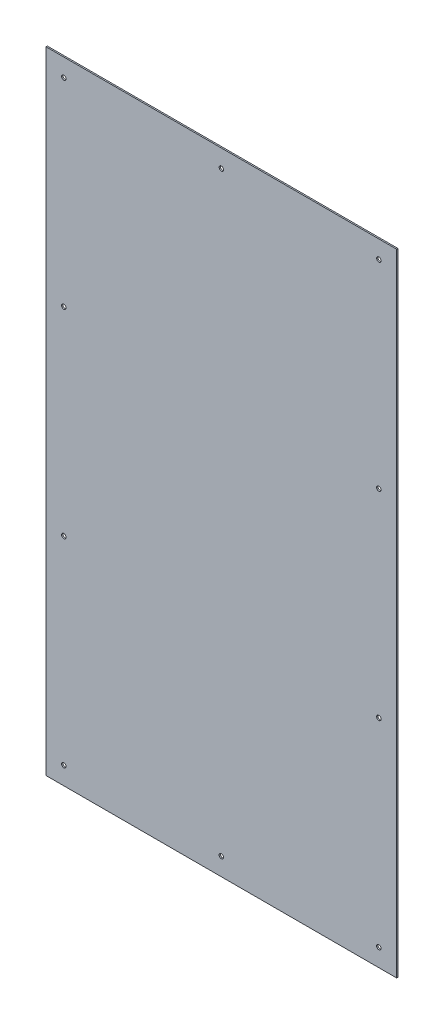
ISO-10303-21;
HEADER;
FILE_DESCRIPTION(('STEP AP214'),'2;1');
FILE_NAME('part.step','',(''),(''),'','','');
FILE_SCHEMA(('AUTOMOTIVE_DESIGN { 1 0 10303 214 1 1 1 1 }'));
ENDSEC;
DATA;
#1=APPLICATION_CONTEXT('core data for automotive mechanical design processes');
#2=APPLICATION_PROTOCOL_DEFINITION('international standard','automotive_design',2000,#1);
#3=PRODUCT_CONTEXT('',#1,'mechanical');
#4=PRODUCT('Part','Part','',(#3));
#5=PRODUCT_RELATED_PRODUCT_CATEGORY('part','',(#4));
#6=PRODUCT_DEFINITION_FORMATION('','',#4);
#7=PRODUCT_DEFINITION_CONTEXT('part definition',#1,'design');
#8=PRODUCT_DEFINITION('design','',#6,#7);
#9=PRODUCT_DEFINITION_SHAPE('','',#8);
#10=(LENGTH_UNIT() NAMED_UNIT(*) SI_UNIT(.MILLI.,.METRE.));
#11=(NAMED_UNIT(*) PLANE_ANGLE_UNIT() SI_UNIT($,.RADIAN.));
#12=(NAMED_UNIT(*) SI_UNIT($,.STERADIAN.) SOLID_ANGLE_UNIT());
#13=UNCERTAINTY_MEASURE_WITH_UNIT(LENGTH_MEASURE(1.E-05),#10,'distance_accuracy_value','');
#14=(GEOMETRIC_REPRESENTATION_CONTEXT(3) GLOBAL_UNCERTAINTY_ASSIGNED_CONTEXT((#13)) GLOBAL_UNIT_ASSIGNED_CONTEXT((#10,
#11,#12)) REPRESENTATION_CONTEXT('',''));
#15=CARTESIAN_POINT('',(0.,0.,0.));
#16=DIRECTION('',(0.,0.,1.));
#17=DIRECTION('',(1.,0.,0.));
#18=AXIS2_PLACEMENT_3D('',#15,#16,#17);
#19=CARTESIAN_POINT('',(250.,450.,1.9));
#20=DIRECTION('',(-1.,0.,0.));
#21=DIRECTION('',(0.,-1.,0.));
#22=AXIS2_PLACEMENT_3D('',#19,#20,#21);
#23=PLANE('',#22);
#24=DIRECTION('',(0.,1.,0.));
#25=VECTOR('',#24,1.);
#26=CARTESIAN_POINT('',(250.,450.,0.));
#27=LINE('',#26,#25);
#28=CARTESIAN_POINT('',(250.,-450.,0.));
#29=VERTEX_POINT('',#28);
#30=CARTESIAN_POINT('',(250.,450.,0.));
#31=VERTEX_POINT('',#30);
#32=EDGE_CURVE('E98',#29,#31,#27,.T.);
#33=ORIENTED_EDGE('',*,*,#32,.T.);
#34=DIRECTION('',(0.,0.,-1.));
#35=VECTOR('',#34,1.);
#36=CARTESIAN_POINT('',(250.,450.,1.9));
#37=LINE('',#36,#35);
#38=CARTESIAN_POINT('',(250.,450.,1.9));
#39=VERTEX_POINT('',#38);
#40=EDGE_CURVE('E11',#39,#31,#37,.T.);
#41=ORIENTED_EDGE('',*,*,#40,.F.);
#42=DIRECTION('',(0.,1.,0.));
#43=VECTOR('',#42,1.);
#44=CARTESIAN_POINT('',(250.,450.,1.9));
#45=LINE('',#44,#43);
#46=CARTESIAN_POINT('',(250.,-450.,1.9));
#47=VERTEX_POINT('',#46);
#48=EDGE_CURVE('E85',#47,#39,#45,.T.);
#49=ORIENTED_EDGE('',*,*,#48,.F.);
#50=DIRECTION('',(0.,0.,-1.));
#51=VECTOR('',#50,1.);
#52=CARTESIAN_POINT('',(250.,-450.,1.9));
#53=LINE('',#52,#51);
#54=EDGE_CURVE('E94',#47,#29,#53,.T.);
#55=ORIENTED_EDGE('',*,*,#54,.T.);
#56=EDGE_LOOP('',(#33,#41,#49,#55));
#57=FACE_BOUND('',#56,.T.);
#58=ADVANCED_FACE('F32',(#57),#23,.F.);
#59=CARTESIAN_POINT('',(-250.,450.,1.9));
#60=DIRECTION('',(0.,-1.,0.));
#61=DIRECTION('',(0.,0.,-1.));
#62=AXIS2_PLACEMENT_3D('',#59,#60,#61);
#63=PLANE('',#62);
#64=DIRECTION('',(-1.,0.,0.));
#65=VECTOR('',#64,1.);
#66=CARTESIAN_POINT('',(-250.,450.,0.));
#67=LINE('',#66,#65);
#68=CARTESIAN_POINT('',(-250.,450.,0.));
#69=VERTEX_POINT('',#68);
#70=EDGE_CURVE('E89',#31,#69,#67,.T.);
#71=ORIENTED_EDGE('',*,*,#70,.T.);
#72=DIRECTION('',(0.,0.,-1.));
#73=VECTOR('',#72,1.);
#74=CARTESIAN_POINT('',(-250.,450.,1.9));
#75=LINE('',#74,#73);
#76=CARTESIAN_POINT('',(-250.,450.,1.9));
#77=VERTEX_POINT('',#76);
#78=EDGE_CURVE('E41',#77,#69,#75,.T.);
#79=ORIENTED_EDGE('',*,*,#78,.F.);
#80=DIRECTION('',(-1.,0.,0.));
#81=VECTOR('',#80,1.);
#82=CARTESIAN_POINT('',(-250.,450.,1.9));
#83=LINE('',#82,#81);
#84=EDGE_CURVE('E80',#39,#77,#83,.T.);
#85=ORIENTED_EDGE('',*,*,#84,.F.);
#86=ORIENTED_EDGE('',*,*,#40,.T.);
#87=EDGE_LOOP('',(#71,#79,#85,#86));
#88=FACE_BOUND('',#87,.T.);
#89=ADVANCED_FACE('F88',(#88),#63,.F.);
#90=CARTESIAN_POINT('',(-250.,450.,1.9));
#91=DIRECTION('',(1.,0.,0.));
#92=DIRECTION('',(0.,1.,0.));
#93=AXIS2_PLACEMENT_3D('',#90,#91,#92);
#94=PLANE('',#93);
#95=DIRECTION('',(0.,-1.,0.));
#96=VECTOR('',#95,1.);
#97=CARTESIAN_POINT('',(-250.,450.,0.));
#98=LINE('',#97,#96);
#99=CARTESIAN_POINT('',(-250.,-450.,0.));
#100=VERTEX_POINT('',#99);
#101=EDGE_CURVE('E67',#69,#100,#98,.T.);
#102=ORIENTED_EDGE('',*,*,#101,.T.);
#103=DIRECTION('',(0.,0.,-1.));
#104=VECTOR('',#103,1.);
#105=CARTESIAN_POINT('',(-250.,-450.,1.9));
#106=LINE('',#105,#104);
#107=CARTESIAN_POINT('',(-250.,-450.,1.9));
#108=VERTEX_POINT('',#107);
#109=EDGE_CURVE('E90',#108,#100,#106,.T.);
#110=ORIENTED_EDGE('',*,*,#109,.F.);
#111=DIRECTION('',(0.,-1.,0.));
#112=VECTOR('',#111,1.);
#113=CARTESIAN_POINT('',(-250.,450.,1.9));
#114=LINE('',#113,#112);
#115=EDGE_CURVE('E83',#77,#108,#114,.T.);
#116=ORIENTED_EDGE('',*,*,#115,.F.);
#117=ORIENTED_EDGE('',*,*,#78,.T.);
#118=EDGE_LOOP('',(#102,#110,#116,#117));
#119=FACE_BOUND('',#118,.T.);
#120=ADVANCED_FACE('F92',(#119),#94,.F.);
#121=CARTESIAN_POINT('',(-250.,-450.,1.9));
#122=DIRECTION('',(0.,1.,0.));
#123=DIRECTION('',(0.,0.,1.));
#124=AXIS2_PLACEMENT_3D('',#121,#122,#123);
#125=PLANE('',#124);
#126=DIRECTION('',(1.,0.,0.));
#127=VECTOR('',#126,1.);
#128=CARTESIAN_POINT('',(-250.,-450.,0.));
#129=LINE('',#128,#127);
#130=EDGE_CURVE('E73',#100,#29,#129,.T.);
#131=ORIENTED_EDGE('',*,*,#130,.T.);
#132=ORIENTED_EDGE('',*,*,#54,.F.);
#133=DIRECTION('',(1.,0.,0.));
#134=VECTOR('',#133,1.);
#135=CARTESIAN_POINT('',(-250.,-450.,1.9));
#136=LINE('',#135,#134);
#137=EDGE_CURVE('E50',#108,#47,#136,.T.);
#138=ORIENTED_EDGE('',*,*,#137,.F.);
#139=ORIENTED_EDGE('',*,*,#109,.T.);
#140=EDGE_LOOP('',(#131,#132,#138,#139));
#141=FACE_BOUND('',#140,.T.);
#142=ADVANCED_FACE('F176',(#141),#125,.F.);
#143=CARTESIAN_POINT('',(0.,0.,1.9));
#144=DIRECTION('',(0.,0.,1.));
#145=DIRECTION('',(1.,0.,0.));
#146=AXIS2_PLACEMENT_3D('',#143,#144,#145);
#147=PLANE('',#146);
#148=CARTESIAN_POINT('',(-224.599999999992,-141.52,1.9));
#149=DIRECTION('',(0.,0.,1.));
#150=DIRECTION('',(1.,0.,0.));
#151=AXIS2_PLACEMENT_3D('',#148,#149,#150);
#152=CIRCLE('',#151,3.175);
#153=CARTESIAN_POINT('',(-221.424999999992,-141.52,1.9));
#154=VERTEX_POINT('',#153);
#155=EDGE_CURVE('E147',#154,#154,#152,.T.);
#156=ORIENTED_EDGE('',*,*,#155,.F.);
#157=EDGE_LOOP('',(#156));
#158=FACE_BOUND('',#157,.T.);
#159=CARTESIAN_POINT('',(224.599999999992,-141.52,1.9));
#160=DIRECTION('',(0.,0.,1.));
#161=DIRECTION('',(-1.,0.,0.));
#162=AXIS2_PLACEMENT_3D('',#159,#160,#161);
#163=CIRCLE('',#162,3.175);
#164=CARTESIAN_POINT('',(221.424999999992,-141.52,1.9));
#165=VERTEX_POINT('',#164);
#166=EDGE_CURVE('E155',#165,#165,#163,.T.);
#167=ORIENTED_EDGE('',*,*,#166,.F.);
#168=EDGE_LOOP('',(#167));
#169=FACE_BOUND('',#168,.T.);
#170=CARTESIAN_POINT('',(224.599999999996,141.54,1.9));
#171=DIRECTION('',(0.,0.,1.));
#172=DIRECTION('',(-1.,0.,0.));
#173=AXIS2_PLACEMENT_3D('',#170,#171,#172);
#174=CIRCLE('',#173,3.175);
#175=CARTESIAN_POINT('',(221.424999999996,141.54,1.9));
#176=VERTEX_POINT('',#175);
#177=EDGE_CURVE('E158',#176,#176,#174,.T.);
#178=ORIENTED_EDGE('',*,*,#177,.F.);
#179=EDGE_LOOP('',(#178));
#180=FACE_BOUND('',#179,.T.);
#181=CARTESIAN_POINT('',(0.,424.6,1.9));
#182=DIRECTION('',(0.,0.,1.));
#183=DIRECTION('',(1.,0.,0.));
#184=AXIS2_PLACEMENT_3D('',#181,#182,#183);
#185=CIRCLE('',#184,3.175);
#186=CARTESIAN_POINT('',(3.17499999999997,424.6,1.9));
#187=VERTEX_POINT('',#186);
#188=EDGE_CURVE('E164',#187,#187,#185,.T.);
#189=ORIENTED_EDGE('',*,*,#188,.F.);
#190=EDGE_LOOP('',(#189));
#191=FACE_BOUND('',#190,.T.);
#192=CARTESIAN_POINT('',(-1.38777878078145E-13,-424.6,1.9));
#193=DIRECTION('',(0.,0.,1.));
#194=DIRECTION('',(-1.,0.,0.));
#195=AXIS2_PLACEMENT_3D('',#192,#193,#194);
#196=CIRCLE('',#195,3.175);
#197=CARTESIAN_POINT('',(-3.17500000000014,-424.6,1.9));
#198=VERTEX_POINT('',#197);
#199=EDGE_CURVE('E161',#198,#198,#196,.T.);
#200=ORIENTED_EDGE('',*,*,#199,.F.);
#201=EDGE_LOOP('',(#200));
#202=FACE_BOUND('',#201,.T.);
#203=CARTESIAN_POINT('',(-224.599999999996,141.54,1.9));
#204=DIRECTION('',(0.,0.,1.));
#205=DIRECTION('',(1.,0.,0.));
#206=AXIS2_PLACEMENT_3D('',#203,#204,#205);
#207=CIRCLE('',#206,3.175);
#208=CARTESIAN_POINT('',(-221.424999999996,141.54,1.9));
#209=VERTEX_POINT('',#208);
#210=EDGE_CURVE('E143',#209,#209,#207,.T.);
#211=ORIENTED_EDGE('',*,*,#210,.F.);
#212=EDGE_LOOP('',(#211));
#213=FACE_BOUND('',#212,.T.);
#214=CARTESIAN_POINT('',(-224.6,-424.6,1.9));
#215=DIRECTION('',(0.,0.,1.));
#216=DIRECTION('',(-1.,0.,0.));
#217=AXIS2_PLACEMENT_3D('',#214,#215,#216);
#218=CIRCLE('',#217,3.17500000000001);
#219=CARTESIAN_POINT('',(-227.775,-424.6,1.9));
#220=VERTEX_POINT('',#219);
#221=EDGE_CURVE('E146',#220,#220,#218,.T.);
#222=ORIENTED_EDGE('',*,*,#221,.F.);
#223=EDGE_LOOP('',(#222));
#224=FACE_BOUND('',#223,.T.);
#225=CARTESIAN_POINT('',(224.6,-424.6,1.9));
#226=DIRECTION('',(0.,0.,1.));
#227=DIRECTION('',(1.,0.,0.));
#228=AXIS2_PLACEMENT_3D('',#225,#226,#227);
#229=CIRCLE('',#228,3.17500000000031);
#230=CARTESIAN_POINT('',(227.775,-424.6,1.9));
#231=VERTEX_POINT('',#230);
#232=EDGE_CURVE('E150',#231,#231,#229,.T.);
#233=ORIENTED_EDGE('',*,*,#232,.F.);
#234=EDGE_LOOP('',(#233));
#235=FACE_BOUND('',#234,.T.);
#236=CARTESIAN_POINT('',(224.6,424.6,1.9));
#237=DIRECTION('',(0.,0.,1.));
#238=DIRECTION('',(-1.,0.,0.));
#239=AXIS2_PLACEMENT_3D('',#236,#237,#238);
#240=CIRCLE('',#239,3.17500000000008);
#241=CARTESIAN_POINT('',(221.425,424.6,1.9));
#242=VERTEX_POINT('',#241);
#243=EDGE_CURVE('E114',#242,#242,#240,.T.);
#244=ORIENTED_EDGE('',*,*,#243,.F.);
#245=EDGE_LOOP('',(#244));
#246=FACE_BOUND('',#245,.T.);
#247=CARTESIAN_POINT('',(-224.6,424.6,1.9));
#248=DIRECTION('',(0.,0.,1.));
#249=DIRECTION('',(1.,0.,0.));
#250=AXIS2_PLACEMENT_3D('',#247,#248,#249);
#251=CIRCLE('',#250,3.175);
#252=CARTESIAN_POINT('',(-221.425,424.6,1.9));
#253=VERTEX_POINT('',#252);
#254=EDGE_CURVE('E109',#253,#253,#251,.T.);
#255=ORIENTED_EDGE('',*,*,#254,.F.);
#256=EDGE_LOOP('',(#255));
#257=FACE_BOUND('',#256,.T.);
#258=ORIENTED_EDGE('',*,*,#48,.T.);
#259=ORIENTED_EDGE('',*,*,#84,.T.);
#260=ORIENTED_EDGE('',*,*,#115,.T.);
#261=ORIENTED_EDGE('',*,*,#137,.T.);
#262=EDGE_LOOP('',(#258,#259,#260,#261));
#263=FACE_BOUND('',#262,.T.);
#264=ADVANCED_FACE('F81',(#158,#169,#180,#191,#202,#213,#224,#235,#246,#257,#263),#147,.T.);
#265=CARTESIAN_POINT('',(0.,0.,0.));
#266=DIRECTION('',(0.,0.,1.));
#267=DIRECTION('',(1.,0.,0.));
#268=AXIS2_PLACEMENT_3D('',#265,#266,#267);
#269=PLANE('',#268);
#270=CARTESIAN_POINT('',(-224.599999999992,-141.52,0.));
#271=DIRECTION('',(0.,0.,1.));
#272=DIRECTION('',(1.,0.,0.));
#273=AXIS2_PLACEMENT_3D('',#270,#271,#272);
#274=CIRCLE('',#273,3.175);
#275=CARTESIAN_POINT('',(-221.424999999992,-141.52,0.));
#276=VERTEX_POINT('',#275);
#277=EDGE_CURVE('E35',#276,#276,#274,.T.);
#278=ORIENTED_EDGE('',*,*,#277,.T.);
#279=EDGE_LOOP('',(#278));
#280=FACE_BOUND('',#279,.T.);
#281=CARTESIAN_POINT('',(224.599999999992,-141.52,0.));
#282=DIRECTION('',(0.,0.,1.));
#283=DIRECTION('',(1.,0.,0.));
#284=AXIS2_PLACEMENT_3D('',#281,#282,#283);
#285=CIRCLE('',#284,3.175);
#286=CARTESIAN_POINT('',(227.774999999992,-141.52,0.));
#287=VERTEX_POINT('',#286);
#288=EDGE_CURVE('E131',#287,#287,#285,.T.);
#289=ORIENTED_EDGE('',*,*,#288,.T.);
#290=EDGE_LOOP('',(#289));
#291=FACE_BOUND('',#290,.T.);
#292=CARTESIAN_POINT('',(224.599999999996,141.54,0.));
#293=DIRECTION('',(0.,0.,1.));
#294=DIRECTION('',(1.,0.,0.));
#295=AXIS2_PLACEMENT_3D('',#292,#293,#294);
#296=CIRCLE('',#295,3.175);
#297=CARTESIAN_POINT('',(227.774999999996,141.54,0.));
#298=VERTEX_POINT('',#297);
#299=EDGE_CURVE('E129',#298,#298,#296,.T.);
#300=ORIENTED_EDGE('',*,*,#299,.T.);
#301=EDGE_LOOP('',(#300));
#302=FACE_BOUND('',#301,.T.);
#303=CARTESIAN_POINT('',(0.,424.6,0.));
#304=DIRECTION('',(0.,0.,1.));
#305=DIRECTION('',(1.,0.,0.));
#306=AXIS2_PLACEMENT_3D('',#303,#304,#305);
#307=CIRCLE('',#306,3.175);
#308=CARTESIAN_POINT('',(3.17499999999997,424.6,0.));
#309=VERTEX_POINT('',#308);
#310=EDGE_CURVE('E126',#309,#309,#307,.T.);
#311=ORIENTED_EDGE('',*,*,#310,.T.);
#312=EDGE_LOOP('',(#311));
#313=FACE_BOUND('',#312,.T.);
#314=CARTESIAN_POINT('',(-1.38777878078145E-13,-424.6,0.));
#315=DIRECTION('',(0.,0.,1.));
#316=DIRECTION('',(1.,0.,0.));
#317=AXIS2_PLACEMENT_3D('',#314,#315,#316);
#318=CIRCLE('',#317,3.175);
#319=CARTESIAN_POINT('',(3.17499999999986,-424.6,0.));
#320=VERTEX_POINT('',#319);
#321=EDGE_CURVE('E123',#320,#320,#318,.T.);
#322=ORIENTED_EDGE('',*,*,#321,.T.);
#323=EDGE_LOOP('',(#322));
#324=FACE_BOUND('',#323,.T.);
#325=CARTESIAN_POINT('',(-224.599999999996,141.54,0.));
#326=DIRECTION('',(0.,0.,1.));
#327=DIRECTION('',(1.,0.,0.));
#328=AXIS2_PLACEMENT_3D('',#325,#326,#327);
#329=CIRCLE('',#328,3.175);
#330=CARTESIAN_POINT('',(-221.424999999996,141.54,0.));
#331=VERTEX_POINT('',#330);
#332=EDGE_CURVE('E120',#331,#331,#329,.T.);
#333=ORIENTED_EDGE('',*,*,#332,.T.);
#334=EDGE_LOOP('',(#333));
#335=FACE_BOUND('',#334,.T.);
#336=CARTESIAN_POINT('',(-224.6,-424.6,0.));
#337=DIRECTION('',(0.,0.,1.));
#338=DIRECTION('',(1.,0.,0.));
#339=AXIS2_PLACEMENT_3D('',#336,#337,#338);
#340=CIRCLE('',#339,3.17500000000001);
#341=CARTESIAN_POINT('',(-221.425,-424.6,0.));
#342=VERTEX_POINT('',#341);
#343=EDGE_CURVE('E117',#342,#342,#340,.T.);
#344=ORIENTED_EDGE('',*,*,#343,.T.);
#345=EDGE_LOOP('',(#344));
#346=FACE_BOUND('',#345,.T.);
#347=CARTESIAN_POINT('',(224.6,-424.6,0.));
#348=DIRECTION('',(0.,0.,1.));
#349=DIRECTION('',(1.,0.,0.));
#350=AXIS2_PLACEMENT_3D('',#347,#348,#349);
#351=CIRCLE('',#350,3.17500000000031);
#352=CARTESIAN_POINT('',(227.775,-424.6,0.));
#353=VERTEX_POINT('',#352);
#354=EDGE_CURVE('E113',#353,#353,#351,.T.);
#355=ORIENTED_EDGE('',*,*,#354,.T.);
#356=EDGE_LOOP('',(#355));
#357=FACE_BOUND('',#356,.T.);
#358=CARTESIAN_POINT('',(224.6,424.6,0.));
#359=DIRECTION('',(0.,0.,1.));
#360=DIRECTION('',(1.,0.,0.));
#361=AXIS2_PLACEMENT_3D('',#358,#359,#360);
#362=CIRCLE('',#361,3.17500000000008);
#363=CARTESIAN_POINT('',(227.775,424.6,0.));
#364=VERTEX_POINT('',#363);
#365=EDGE_CURVE('E110',#364,#364,#362,.T.);
#366=ORIENTED_EDGE('',*,*,#365,.T.);
#367=EDGE_LOOP('',(#366));
#368=FACE_BOUND('',#367,.T.);
#369=CARTESIAN_POINT('',(-224.6,424.6,0.));
#370=DIRECTION('',(0.,0.,1.));
#371=DIRECTION('',(1.,0.,0.));
#372=AXIS2_PLACEMENT_3D('',#369,#370,#371);
#373=CIRCLE('',#372,3.175);
#374=CARTESIAN_POINT('',(-221.425,424.6,0.));
#375=VERTEX_POINT('',#374);
#376=EDGE_CURVE('E101',#375,#375,#373,.T.);
#377=ORIENTED_EDGE('',*,*,#376,.T.);
#378=EDGE_LOOP('',(#377));
#379=FACE_BOUND('',#378,.T.);
#380=ORIENTED_EDGE('',*,*,#32,.F.);
#381=ORIENTED_EDGE('',*,*,#130,.F.);
#382=ORIENTED_EDGE('',*,*,#101,.F.);
#383=ORIENTED_EDGE('',*,*,#70,.F.);
#384=EDGE_LOOP('',(#380,#381,#382,#383));
#385=FACE_BOUND('',#384,.T.);
#386=ADVANCED_FACE('F175',(#280,#291,#302,#313,#324,#335,#346,#357,#368,#379,#385),#269,.F.);
#387=CARTESIAN_POINT('',(-224.6,424.6,-8.1));
#388=DIRECTION('',(0.,0.,1.));
#389=DIRECTION('',(1.,0.,0.));
#390=AXIS2_PLACEMENT_3D('',#387,#388,#389);
#391=CYLINDRICAL_SURFACE('',#390,3.175);
#392=ORIENTED_EDGE('',*,*,#254,.T.);
#393=EDGE_LOOP('',(#392));
#394=FACE_BOUND('',#393,.T.);
#395=ORIENTED_EDGE('',*,*,#376,.F.);
#396=EDGE_LOOP('',(#395));
#397=FACE_BOUND('',#396,.T.);
#398=ADVANCED_FACE('F196',(#394,#397),#391,.F.);
#399=CARTESIAN_POINT('',(224.6,424.6,-8.1));
#400=DIRECTION('',(0.,0.,1.));
#401=DIRECTION('',(1.,0.,0.));
#402=AXIS2_PLACEMENT_3D('',#399,#400,#401);
#403=CYLINDRICAL_SURFACE('',#402,3.17500000000008);
#404=ORIENTED_EDGE('',*,*,#243,.T.);
#405=EDGE_LOOP('',(#404));
#406=FACE_BOUND('',#405,.T.);
#407=ORIENTED_EDGE('',*,*,#365,.F.);
#408=EDGE_LOOP('',(#407));
#409=FACE_BOUND('',#408,.T.);
#410=ADVANCED_FACE('F192',(#406,#409),#403,.F.);
#411=CARTESIAN_POINT('',(224.6,-424.6,-8.1));
#412=DIRECTION('',(0.,0.,1.));
#413=DIRECTION('',(1.,0.,0.));
#414=AXIS2_PLACEMENT_3D('',#411,#412,#413);
#415=CYLINDRICAL_SURFACE('',#414,3.17500000000031);
#416=ORIENTED_EDGE('',*,*,#232,.T.);
#417=EDGE_LOOP('',(#416));
#418=FACE_BOUND('',#417,.T.);
#419=ORIENTED_EDGE('',*,*,#354,.F.);
#420=EDGE_LOOP('',(#419));
#421=FACE_BOUND('',#420,.T.);
#422=ADVANCED_FACE('F195',(#418,#421),#415,.F.);
#423=CARTESIAN_POINT('',(-224.6,-424.6,-8.1));
#424=DIRECTION('',(0.,0.,1.));
#425=DIRECTION('',(1.,0.,0.));
#426=AXIS2_PLACEMENT_3D('',#423,#424,#425);
#427=CYLINDRICAL_SURFACE('',#426,3.17500000000001);
#428=ORIENTED_EDGE('',*,*,#221,.T.);
#429=EDGE_LOOP('',(#428));
#430=FACE_BOUND('',#429,.T.);
#431=ORIENTED_EDGE('',*,*,#343,.F.);
#432=EDGE_LOOP('',(#431));
#433=FACE_BOUND('',#432,.T.);
#434=ADVANCED_FACE('F262',(#430,#433),#427,.F.);
#435=CARTESIAN_POINT('',(-224.599999999996,141.54,-8.1));
#436=DIRECTION('',(0.,0.,1.));
#437=DIRECTION('',(1.,0.,0.));
#438=AXIS2_PLACEMENT_3D('',#435,#436,#437);
#439=CYLINDRICAL_SURFACE('',#438,3.175);
#440=ORIENTED_EDGE('',*,*,#210,.T.);
#441=EDGE_LOOP('',(#440));
#442=FACE_BOUND('',#441,.T.);
#443=ORIENTED_EDGE('',*,*,#332,.F.);
#444=EDGE_LOOP('',(#443));
#445=FACE_BOUND('',#444,.T.);
#446=ADVANCED_FACE('F272',(#442,#445),#439,.F.);
#447=CARTESIAN_POINT('',(-1.38777878078145E-13,-424.6,-8.1));
#448=DIRECTION('',(0.,0.,1.));
#449=DIRECTION('',(1.,0.,0.));
#450=AXIS2_PLACEMENT_3D('',#447,#448,#449);
#451=CYLINDRICAL_SURFACE('',#450,3.175);
#452=ORIENTED_EDGE('',*,*,#199,.T.);
#453=EDGE_LOOP('',(#452));
#454=FACE_BOUND('',#453,.T.);
#455=ORIENTED_EDGE('',*,*,#321,.F.);
#456=EDGE_LOOP('',(#455));
#457=FACE_BOUND('',#456,.T.);
#458=ADVANCED_FACE('F282',(#454,#457),#451,.F.);
#459=CARTESIAN_POINT('',(0.,424.6,-8.1));
#460=DIRECTION('',(0.,0.,1.));
#461=DIRECTION('',(1.,0.,0.));
#462=AXIS2_PLACEMENT_3D('',#459,#460,#461);
#463=CYLINDRICAL_SURFACE('',#462,3.175);
#464=ORIENTED_EDGE('',*,*,#188,.T.);
#465=EDGE_LOOP('',(#464));
#466=FACE_BOUND('',#465,.T.);
#467=ORIENTED_EDGE('',*,*,#310,.F.);
#468=EDGE_LOOP('',(#467));
#469=FACE_BOUND('',#468,.T.);
#470=ADVANCED_FACE('F292',(#466,#469),#463,.F.);
#471=CARTESIAN_POINT('',(224.599999999996,141.54,-8.1));
#472=DIRECTION('',(0.,0.,1.));
#473=DIRECTION('',(1.,0.,0.));
#474=AXIS2_PLACEMENT_3D('',#471,#472,#473);
#475=CYLINDRICAL_SURFACE('',#474,3.175);
#476=ORIENTED_EDGE('',*,*,#177,.T.);
#477=EDGE_LOOP('',(#476));
#478=FACE_BOUND('',#477,.T.);
#479=ORIENTED_EDGE('',*,*,#299,.F.);
#480=EDGE_LOOP('',(#479));
#481=FACE_BOUND('',#480,.T.);
#482=ADVANCED_FACE('F170',(#478,#481),#475,.F.);
#483=CARTESIAN_POINT('',(224.599999999992,-141.52,-8.1));
#484=DIRECTION('',(0.,0.,1.));
#485=DIRECTION('',(1.,0.,0.));
#486=AXIS2_PLACEMENT_3D('',#483,#484,#485);
#487=CYLINDRICAL_SURFACE('',#486,3.175);
#488=ORIENTED_EDGE('',*,*,#166,.T.);
#489=EDGE_LOOP('',(#488));
#490=FACE_BOUND('',#489,.T.);
#491=ORIENTED_EDGE('',*,*,#288,.F.);
#492=EDGE_LOOP('',(#491));
#493=FACE_BOUND('',#492,.T.);
#494=ADVANCED_FACE('F311',(#490,#493),#487,.F.);
#495=CARTESIAN_POINT('',(-224.599999999992,-141.52,-8.1));
#496=DIRECTION('',(0.,0.,1.));
#497=DIRECTION('',(1.,0.,0.));
#498=AXIS2_PLACEMENT_3D('',#495,#496,#497);
#499=CYLINDRICAL_SURFACE('',#498,3.175);
#500=ORIENTED_EDGE('',*,*,#155,.T.);
#501=EDGE_LOOP('',(#500));
#502=FACE_BOUND('',#501,.T.);
#503=ORIENTED_EDGE('',*,*,#277,.F.);
#504=EDGE_LOOP('',(#503));
#505=FACE_BOUND('',#504,.T.);
#506=ADVANCED_FACE('F320',(#502,#505),#499,.F.);
#507=CLOSED_SHELL('',(#58,#89,#120,#142,#264,#386,#398,#410,#422,#434,#446,#458,#470,#482,#494,#506));
#508=MANIFOLD_SOLID_BREP('B2',#507);
#509=ADVANCED_BREP_SHAPE_REPRESENTATION('',(#18,#508),#14);
#510=SHAPE_DEFINITION_REPRESENTATION(#9,#509);
ENDSEC;
END-ISO-10303-21;
